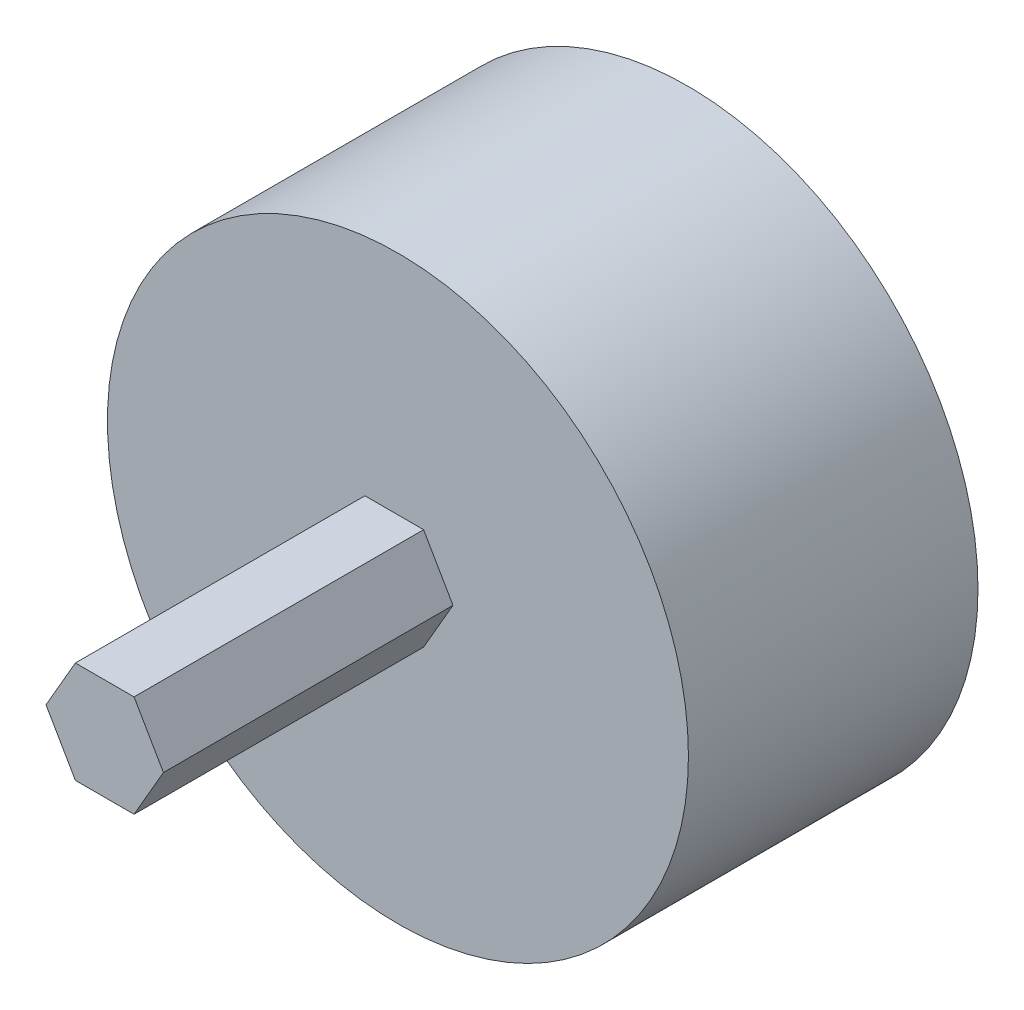
ISO-10303-21;
HEADER;
FILE_DESCRIPTION(('STEP AP214'),'2;1');
FILE_NAME('part.step','',(''),(''),'','','');
FILE_SCHEMA(('AUTOMOTIVE_DESIGN { 1 0 10303 214 1 1 1 1 }'));
ENDSEC;
DATA;
#1=APPLICATION_CONTEXT('core data for automotive mechanical design processes');
#2=APPLICATION_PROTOCOL_DEFINITION('international standard','automotive_design',2000,#1);
#3=PRODUCT_CONTEXT('',#1,'mechanical');
#4=PRODUCT('Part','Part','',(#3));
#5=PRODUCT_RELATED_PRODUCT_CATEGORY('part','',(#4));
#6=PRODUCT_DEFINITION_FORMATION('','',#4);
#7=PRODUCT_DEFINITION_CONTEXT('part definition',#1,'design');
#8=PRODUCT_DEFINITION('design','',#6,#7);
#9=PRODUCT_DEFINITION_SHAPE('','',#8);
#10=(LENGTH_UNIT() NAMED_UNIT(*) SI_UNIT(.MILLI.,.METRE.));
#11=(NAMED_UNIT(*) PLANE_ANGLE_UNIT() SI_UNIT($,.RADIAN.));
#12=(NAMED_UNIT(*) SI_UNIT($,.STERADIAN.) SOLID_ANGLE_UNIT());
#13=UNCERTAINTY_MEASURE_WITH_UNIT(LENGTH_MEASURE(1.E-05),#10,'distance_accuracy_value','');
#14=(GEOMETRIC_REPRESENTATION_CONTEXT(3) GLOBAL_UNCERTAINTY_ASSIGNED_CONTEXT((#13)) GLOBAL_UNIT_ASSIGNED_CONTEXT((#10,
#11,#12)) REPRESENTATION_CONTEXT('',''));
#15=CARTESIAN_POINT('',(0.,0.,0.));
#16=DIRECTION('',(0.,0.,1.));
#17=DIRECTION('',(1.,0.,0.));
#18=AXIS2_PLACEMENT_3D('',#15,#16,#17);
#19=CARTESIAN_POINT('',(-25.3844570559266,7.75230079438462,75.946));
#20=DIRECTION('',(0.,0.,1.));
#21=DIRECTION('',(1.,0.,0.));
#22=AXIS2_PLACEMENT_3D('',#19,#20,#21);
#23=PLANE('',#22);
#24=CARTESIAN_POINT('',(-25.3844570559266,7.75230079438462,75.946));
#25=DIRECTION('',(0.,0.,1.));
#26=DIRECTION('',(1.,0.,0.));
#27=AXIS2_PLACEMENT_3D('',#24,#25,#26);
#28=CIRCLE('',#27,76.1919372584615);
#29=CARTESIAN_POINT('',(50.8074802025349,7.75230079438462,75.946));
#30=VERTEX_POINT('',#29);
#31=EDGE_CURVE('E11',#30,#30,#28,.T.);
#32=ORIENTED_EDGE('',*,*,#31,.T.);
#33=EDGE_LOOP('',(#32));
#34=FACE_BOUND('',#33,.T.);
#35=DIRECTION('',(-0.5,0.866025403784439,0.));
#36=VECTOR('',#35,1.);
#37=CARTESIAN_POINT('',(-10.9499166266643,11.1352984706273,75.946));
#38=LINE('',#37,#36);
#39=CARTESIAN_POINT('',(-10.9499166266643,11.1352984706273,75.946));
#40=VERTEX_POINT('',#39);
#41=CARTESIAN_POINT('',(-18.6488824663079,24.4702984706273,75.946));
#42=VERTEX_POINT('',#41);
#43=EDGE_CURVE('E120',#40,#42,#38,.T.);
#44=ORIENTED_EDGE('',*,*,#43,.F.);
#45=DIRECTION('',(0.5,0.866025403784439,0.));
#46=VECTOR('',#45,1.);
#47=CARTESIAN_POINT('',(-18.6488824663079,-2.1997015293727,75.946));
#48=LINE('',#47,#46);
#49=CARTESIAN_POINT('',(-18.6488824663079,-2.1997015293727,75.946));
#50=VERTEX_POINT('',#49);
#51=EDGE_CURVE('E117',#50,#40,#48,.T.);
#52=ORIENTED_EDGE('',*,*,#51,.F.);
#53=DIRECTION('',(1.,0.,0.));
#54=VECTOR('',#53,1.);
#55=CARTESIAN_POINT('',(-34.0468141455953,-2.19970152937271,75.946));
#56=LINE('',#55,#54);
#57=CARTESIAN_POINT('',(-34.0468141455953,-2.1997015293727,75.946));
#58=VERTEX_POINT('',#57);
#59=EDGE_CURVE('E76',#58,#50,#56,.T.);
#60=ORIENTED_EDGE('',*,*,#59,.F.);
#61=DIRECTION('',(0.5,-0.866025403784439,0.));
#62=VECTOR('',#61,1.);
#63=CARTESIAN_POINT('',(-41.7457799852389,11.1352984706273,75.946));
#64=LINE('',#63,#62);
#65=CARTESIAN_POINT('',(-41.7457799852389,11.1352984706273,75.946));
#66=VERTEX_POINT('',#65);
#67=EDGE_CURVE('E125',#66,#58,#64,.T.);
#68=ORIENTED_EDGE('',*,*,#67,.F.);
#69=DIRECTION('',(-0.5,-0.866025403784438,0.));
#70=VECTOR('',#69,1.);
#71=CARTESIAN_POINT('',(-34.0468141455953,24.4702984706273,75.946));
#72=LINE('',#71,#70);
#73=CARTESIAN_POINT('',(-34.0468141455953,24.4702984706273,75.946));
#74=VERTEX_POINT('',#73);
#75=EDGE_CURVE('E106',#74,#66,#72,.T.);
#76=ORIENTED_EDGE('',*,*,#75,.F.);
#77=DIRECTION('',(-1.,0.,0.));
#78=VECTOR('',#77,1.);
#79=CARTESIAN_POINT('',(-18.6488824663079,24.4702984706273,75.946));
#80=LINE('',#79,#78);
#81=EDGE_CURVE('E122',#42,#74,#80,.T.);
#82=ORIENTED_EDGE('',*,*,#81,.F.);
#83=EDGE_LOOP('',(#44,#52,#60,#68,#76,#82));
#84=FACE_BOUND('',#83,.T.);
#85=ADVANCED_FACE('F33',(#34,#84),#23,.T.);
#86=CARTESIAN_POINT('',(-25.3844570559266,7.75230079438462,75.946));
#87=DIRECTION('',(0.,0.,-1.));
#88=DIRECTION('',(-1.,0.,0.));
#89=AXIS2_PLACEMENT_3D('',#86,#87,#88);
#90=CYLINDRICAL_SURFACE('',#89,76.1919372584615);
#91=ORIENTED_EDGE('',*,*,#31,.F.);
#92=EDGE_LOOP('',(#91));
#93=FACE_BOUND('',#92,.T.);
#94=CARTESIAN_POINT('',(-25.3844570559266,7.75230079438462,0.));
#95=DIRECTION('',(0.,0.,1.));
#96=DIRECTION('',(1.,0.,0.));
#97=AXIS2_PLACEMENT_3D('',#94,#95,#96);
#98=CIRCLE('',#97,76.1919372584615);
#99=CARTESIAN_POINT('',(50.8074802025349,7.75230079438462,0.));
#100=VERTEX_POINT('',#99);
#101=EDGE_CURVE('E37',#100,#100,#98,.T.);
#102=ORIENTED_EDGE('',*,*,#101,.T.);
#103=EDGE_LOOP('',(#102));
#104=FACE_BOUND('',#103,.T.);
#105=ADVANCED_FACE('F35',(#93,#104),#90,.T.);
#106=CARTESIAN_POINT('',(-25.3844570559266,7.75230079438462,0.));
#107=DIRECTION('',(0.,0.,1.));
#108=DIRECTION('',(1.,0.,0.));
#109=AXIS2_PLACEMENT_3D('',#106,#107,#108);
#110=PLANE('',#109);
#111=ORIENTED_EDGE('',*,*,#101,.F.);
#112=EDGE_LOOP('',(#111));
#113=FACE_BOUND('',#112,.T.);
#114=ADVANCED_FACE('F141',(#113),#110,.F.);
#115=CARTESIAN_POINT('',(-18.6488824663079,-2.1997015293727,151.892));
#116=DIRECTION('',(-0.866025403784439,0.5,0.));
#117=DIRECTION('',(-0.5,-0.866025403784439,0.));
#118=AXIS2_PLACEMENT_3D('',#115,#116,#117);
#119=PLANE('',#118);
#120=ORIENTED_EDGE('',*,*,#51,.T.);
#121=DIRECTION('',(0.,0.,-1.));
#122=VECTOR('',#121,1.);
#123=CARTESIAN_POINT('',(-10.9499166266643,11.1352984706273,151.892));
#124=LINE('',#123,#122);
#125=CARTESIAN_POINT('',(-10.9499166266643,11.1352984706273,151.892));
#126=VERTEX_POINT('',#125);
#127=EDGE_CURVE('E135',#126,#40,#124,.T.);
#128=ORIENTED_EDGE('',*,*,#127,.F.);
#129=DIRECTION('',(0.5,0.866025403784439,0.));
#130=VECTOR('',#129,1.);
#131=CARTESIAN_POINT('',(-18.6488824663079,-2.1997015293727,151.892));
#132=LINE('',#131,#130);
#133=CARTESIAN_POINT('',(-18.6488824663079,-2.1997015293727,151.892));
#134=VERTEX_POINT('',#133);
#135=EDGE_CURVE('E128',#134,#126,#132,.T.);
#136=ORIENTED_EDGE('',*,*,#135,.F.);
#137=DIRECTION('',(0.,0.,-1.));
#138=VECTOR('',#137,1.);
#139=CARTESIAN_POINT('',(-18.6488824663079,-2.1997015293727,151.892));
#140=LINE('',#139,#138);
#141=EDGE_CURVE('E113',#134,#50,#140,.T.);
#142=ORIENTED_EDGE('',*,*,#141,.T.);
#143=EDGE_LOOP('',(#120,#128,#136,#142));
#144=FACE_BOUND('',#143,.T.);
#145=ADVANCED_FACE('F143',(#144),#119,.F.);
#146=CARTESIAN_POINT('',(-10.9499166266643,11.1352984706273,151.892));
#147=DIRECTION('',(-0.866025403784439,-0.5,0.));
#148=DIRECTION('',(0.5,-0.866025403784439,0.));
#149=AXIS2_PLACEMENT_3D('',#146,#147,#148);
#150=PLANE('',#149);
#151=ORIENTED_EDGE('',*,*,#43,.T.);
#152=DIRECTION('',(0.,0.,-1.));
#153=VECTOR('',#152,1.);
#154=CARTESIAN_POINT('',(-18.6488824663079,24.4702984706273,151.892));
#155=LINE('',#154,#153);
#156=CARTESIAN_POINT('',(-18.6488824663079,24.4702984706273,151.892));
#157=VERTEX_POINT('',#156);
#158=EDGE_CURVE('E132',#157,#42,#155,.T.);
#159=ORIENTED_EDGE('',*,*,#158,.F.);
#160=DIRECTION('',(-0.5,0.866025403784439,0.));
#161=VECTOR('',#160,1.);
#162=CARTESIAN_POINT('',(-10.9499166266643,11.1352984706273,151.892));
#163=LINE('',#162,#161);
#164=EDGE_CURVE('E84',#126,#157,#163,.T.);
#165=ORIENTED_EDGE('',*,*,#164,.F.);
#166=ORIENTED_EDGE('',*,*,#127,.T.);
#167=EDGE_LOOP('',(#151,#159,#165,#166));
#168=FACE_BOUND('',#167,.T.);
#169=ADVANCED_FACE('F148',(#168),#150,.F.);
#170=CARTESIAN_POINT('',(-18.6488824663079,24.4702984706273,151.892));
#171=DIRECTION('',(0.,-1.,0.));
#172=DIRECTION('',(1.,0.,0.));
#173=AXIS2_PLACEMENT_3D('',#170,#171,#172);
#174=PLANE('',#173);
#175=ORIENTED_EDGE('',*,*,#81,.T.);
#176=DIRECTION('',(0.,0.,-1.));
#177=VECTOR('',#176,1.);
#178=CARTESIAN_POINT('',(-34.0468141455953,24.4702984706273,151.892));
#179=LINE('',#178,#177);
#180=CARTESIAN_POINT('',(-34.0468141455953,24.4702984706273,151.892));
#181=VERTEX_POINT('',#180);
#182=EDGE_CURVE('E109',#181,#74,#179,.T.);
#183=ORIENTED_EDGE('',*,*,#182,.F.);
#184=DIRECTION('',(-1.,0.,0.));
#185=VECTOR('',#184,1.);
#186=CARTESIAN_POINT('',(-18.6488824663079,24.4702984706273,151.892));
#187=LINE('',#186,#185);
#188=EDGE_CURVE('E97',#157,#181,#187,.T.);
#189=ORIENTED_EDGE('',*,*,#188,.F.);
#190=ORIENTED_EDGE('',*,*,#158,.T.);
#191=EDGE_LOOP('',(#175,#183,#189,#190));
#192=FACE_BOUND('',#191,.T.);
#193=ADVANCED_FACE('F161',(#192),#174,.F.);
#194=CARTESIAN_POINT('',(-34.0468141455953,24.4702984706273,151.892));
#195=DIRECTION('',(0.866025403784438,-0.5,0.));
#196=DIRECTION('',(0.5,0.866025403784439,0.));
#197=AXIS2_PLACEMENT_3D('',#194,#195,#196);
#198=PLANE('',#197);
#199=ORIENTED_EDGE('',*,*,#75,.T.);
#200=DIRECTION('',(0.,0.,-1.));
#201=VECTOR('',#200,1.);
#202=CARTESIAN_POINT('',(-41.7457799852389,11.1352984706273,151.892));
#203=LINE('',#202,#201);
#204=CARTESIAN_POINT('',(-41.7457799852389,11.1352984706273,151.892));
#205=VERTEX_POINT('',#204);
#206=EDGE_CURVE('E103',#205,#66,#203,.T.);
#207=ORIENTED_EDGE('',*,*,#206,.F.);
#208=DIRECTION('',(-0.5,-0.866025403784438,0.));
#209=VECTOR('',#208,1.);
#210=CARTESIAN_POINT('',(-34.0468141455953,24.4702984706273,151.892));
#211=LINE('',#210,#209);
#212=EDGE_CURVE('E91',#181,#205,#211,.T.);
#213=ORIENTED_EDGE('',*,*,#212,.F.);
#214=ORIENTED_EDGE('',*,*,#182,.T.);
#215=EDGE_LOOP('',(#199,#207,#213,#214));
#216=FACE_BOUND('',#215,.T.);
#217=ADVANCED_FACE('F104',(#216),#198,.F.);
#218=CARTESIAN_POINT('',(-41.7457799852389,11.1352984706273,151.892));
#219=DIRECTION('',(0.866025403784439,0.5,0.));
#220=DIRECTION('',(-0.5,0.866025403784439,0.));
#221=AXIS2_PLACEMENT_3D('',#218,#219,#220);
#222=PLANE('',#221);
#223=ORIENTED_EDGE('',*,*,#67,.T.);
#224=DIRECTION('',(0.,0.,-1.));
#225=VECTOR('',#224,1.);
#226=CARTESIAN_POINT('',(-34.0468141455953,-2.19970152937271,151.892));
#227=LINE('',#226,#225);
#228=CARTESIAN_POINT('',(-34.0468141455953,-2.19970152937271,151.892));
#229=VERTEX_POINT('',#228);
#230=EDGE_CURVE('E48',#229,#58,#227,.T.);
#231=ORIENTED_EDGE('',*,*,#230,.F.);
#232=DIRECTION('',(0.5,-0.866025403784439,0.));
#233=VECTOR('',#232,1.);
#234=CARTESIAN_POINT('',(-41.7457799852389,11.1352984706273,151.892));
#235=LINE('',#234,#233);
#236=EDGE_CURVE('E95',#205,#229,#235,.T.);
#237=ORIENTED_EDGE('',*,*,#236,.F.);
#238=ORIENTED_EDGE('',*,*,#206,.T.);
#239=EDGE_LOOP('',(#223,#231,#237,#238));
#240=FACE_BOUND('',#239,.T.);
#241=ADVANCED_FACE('F111',(#240),#222,.F.);
#242=CARTESIAN_POINT('',(-34.0468141455953,-2.19970152937271,151.892));
#243=DIRECTION('',(0.,1.,0.));
#244=DIRECTION('',(-1.,0.,0.));
#245=AXIS2_PLACEMENT_3D('',#242,#243,#244);
#246=PLANE('',#245);
#247=ORIENTED_EDGE('',*,*,#59,.T.);
#248=ORIENTED_EDGE('',*,*,#141,.F.);
#249=DIRECTION('',(1.,0.,0.));
#250=VECTOR('',#249,1.);
#251=CARTESIAN_POINT('',(-34.0468141455953,-2.19970152937271,151.892));
#252=LINE('',#251,#250);
#253=EDGE_CURVE('E56',#229,#134,#252,.T.);
#254=ORIENTED_EDGE('',*,*,#253,.F.);
#255=ORIENTED_EDGE('',*,*,#230,.T.);
#256=EDGE_LOOP('',(#247,#248,#254,#255));
#257=FACE_BOUND('',#256,.T.);
#258=ADVANCED_FACE('F169',(#257),#246,.F.);
#259=CARTESIAN_POINT('',(0.,0.,151.892));
#260=DIRECTION('',(0.,0.,1.));
#261=DIRECTION('',(1.,0.,0.));
#262=AXIS2_PLACEMENT_3D('',#259,#260,#261);
#263=PLANE('',#262);
#264=ORIENTED_EDGE('',*,*,#135,.T.);
#265=ORIENTED_EDGE('',*,*,#164,.T.);
#266=ORIENTED_EDGE('',*,*,#188,.T.);
#267=ORIENTED_EDGE('',*,*,#212,.T.);
#268=ORIENTED_EDGE('',*,*,#236,.T.);
#269=ORIENTED_EDGE('',*,*,#253,.T.);
#270=EDGE_LOOP('',(#264,#265,#266,#267,#268,#269));
#271=FACE_BOUND('',#270,.T.);
#272=ADVANCED_FACE('F93',(#271),#263,.T.);
#273=CLOSED_SHELL('',(#85,#105,#114,#145,#169,#193,#217,#241,#258,#272));
#274=MANIFOLD_SOLID_BREP('B2',#273);
#275=ADVANCED_BREP_SHAPE_REPRESENTATION('',(#18,#274),#14);
#276=SHAPE_DEFINITION_REPRESENTATION(#9,#275);
ENDSEC;
END-ISO-10303-21;
